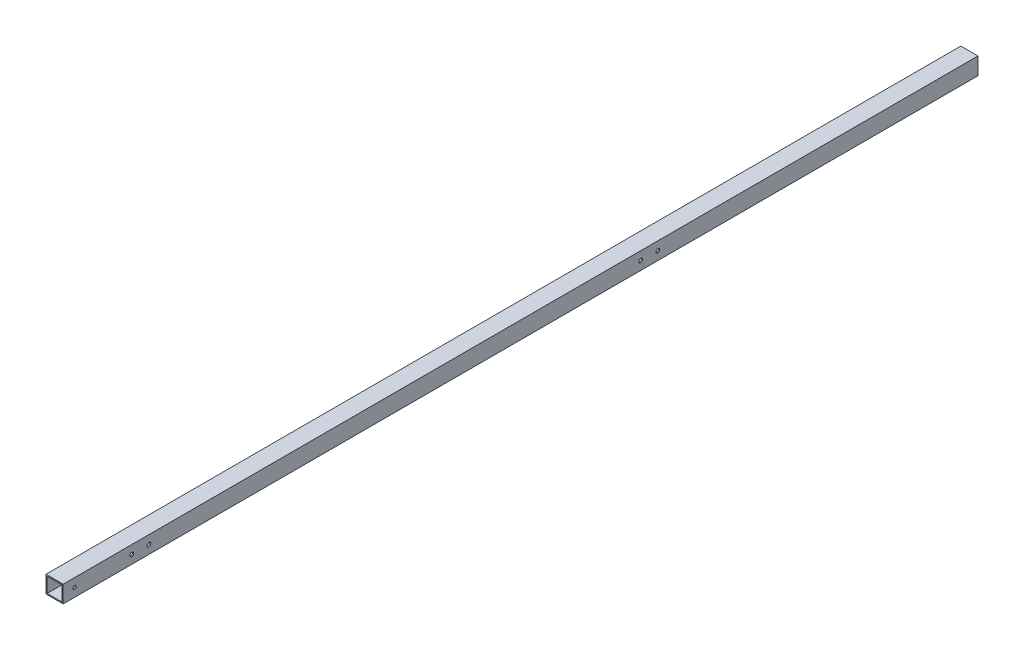
ISO-10303-21;
HEADER;
FILE_DESCRIPTION(('STEP AP214'),'2;1');
FILE_NAME('part.step','',(''),(''),'','','');
FILE_SCHEMA(('AUTOMOTIVE_DESIGN { 1 0 10303 214 1 1 1 1 }'));
ENDSEC;
DATA;
#1=APPLICATION_CONTEXT('core data for automotive mechanical design processes');
#2=APPLICATION_PROTOCOL_DEFINITION('international standard','automotive_design',2000,#1);
#3=PRODUCT_CONTEXT('',#1,'mechanical');
#4=PRODUCT('Part','Part','',(#3));
#5=PRODUCT_RELATED_PRODUCT_CATEGORY('part','',(#4));
#6=PRODUCT_DEFINITION_FORMATION('','',#4);
#7=PRODUCT_DEFINITION_CONTEXT('part definition',#1,'design');
#8=PRODUCT_DEFINITION('design','',#6,#7);
#9=PRODUCT_DEFINITION_SHAPE('','',#8);
#10=(LENGTH_UNIT() NAMED_UNIT(*) SI_UNIT(.MILLI.,.METRE.));
#11=(NAMED_UNIT(*) PLANE_ANGLE_UNIT() SI_UNIT($,.RADIAN.));
#12=(NAMED_UNIT(*) SI_UNIT($,.STERADIAN.) SOLID_ANGLE_UNIT());
#13=UNCERTAINTY_MEASURE_WITH_UNIT(LENGTH_MEASURE(1.E-05),#10,'distance_accuracy_value','');
#14=(GEOMETRIC_REPRESENTATION_CONTEXT(3) GLOBAL_UNCERTAINTY_ASSIGNED_CONTEXT((#13)) GLOBAL_UNIT_ASSIGNED_CONTEXT((#10,
#11,#12)) REPRESENTATION_CONTEXT('',''));
#15=CARTESIAN_POINT('',(0.,0.,0.));
#16=DIRECTION('',(0.,0.,1.));
#17=DIRECTION('',(1.,0.,0.));
#18=AXIS2_PLACEMENT_3D('',#15,#16,#17);
#19=CARTESIAN_POINT('',(0.,0.,800.));
#20=DIRECTION('',(0.,0.,1.));
#21=DIRECTION('',(1.,0.,0.));
#22=AXIS2_PLACEMENT_3D('',#19,#20,#21);
#23=PLANE('',#22);
#24=DIRECTION('',(0.,-1.,0.));
#25=VECTOR('',#24,1.);
#26=CARTESIAN_POINT('',(0.,0.,800.));
#27=LINE('',#26,#25);
#28=CARTESIAN_POINT('',(0.,0.,800.));
#29=VERTEX_POINT('',#28);
#30=CARTESIAN_POINT('',(0.,-15.,800.));
#31=VERTEX_POINT('',#30);
#32=EDGE_CURVE('E170',#29,#31,#27,.T.);
#33=ORIENTED_EDGE('',*,*,#32,.T.);
#34=DIRECTION('',(1.,0.,0.));
#35=VECTOR('',#34,1.);
#36=CARTESIAN_POINT('',(0.,-15.,800.));
#37=LINE('',#36,#35);
#38=CARTESIAN_POINT('',(15.,-15.,800.));
#39=VERTEX_POINT('',#38);
#40=EDGE_CURVE('E173',#31,#39,#37,.T.);
#41=ORIENTED_EDGE('',*,*,#40,.T.);
#42=DIRECTION('',(0.,1.,0.));
#43=VECTOR('',#42,1.);
#44=CARTESIAN_POINT('',(15.,0.,800.));
#45=LINE('',#44,#43);
#46=CARTESIAN_POINT('',(15.,0.,800.));
#47=VERTEX_POINT('',#46);
#48=EDGE_CURVE('E176',#39,#47,#45,.T.);
#49=ORIENTED_EDGE('',*,*,#48,.T.);
#50=DIRECTION('',(-1.,0.,0.));
#51=VECTOR('',#50,1.);
#52=CARTESIAN_POINT('',(0.,0.,800.));
#53=LINE('',#52,#51);
#54=EDGE_CURVE('E178',#47,#29,#53,.T.);
#55=ORIENTED_EDGE('',*,*,#54,.T.);
#56=EDGE_LOOP('',(#33,#41,#49,#55));
#57=FACE_BOUND('',#56,.T.);
#58=DIRECTION('',(1.,0.,0.));
#59=VECTOR('',#58,1.);
#60=CARTESIAN_POINT('',(0.,-14.,800.));
#61=LINE('',#60,#59);
#62=CARTESIAN_POINT('',(1.,-14.,800.));
#63=VERTEX_POINT('',#62);
#64=CARTESIAN_POINT('',(14.,-14.,800.));
#65=VERTEX_POINT('',#64);
#66=EDGE_CURVE('E140',#63,#65,#61,.T.);
#67=ORIENTED_EDGE('',*,*,#66,.F.);
#68=DIRECTION('',(0.,-1.,0.));
#69=VECTOR('',#68,1.);
#70=CARTESIAN_POINT('',(1.,0.,800.));
#71=LINE('',#70,#69);
#72=CARTESIAN_POINT('',(1.,-1.,800.));
#73=VERTEX_POINT('',#72);
#74=EDGE_CURVE('E132',#73,#63,#71,.T.);
#75=ORIENTED_EDGE('',*,*,#74,.F.);
#76=DIRECTION('',(-1.,0.,0.));
#77=VECTOR('',#76,1.);
#78=CARTESIAN_POINT('',(0.,-1.,800.));
#79=LINE('',#78,#77);
#80=CARTESIAN_POINT('',(14.,-1.,800.));
#81=VERTEX_POINT('',#80);
#82=EDGE_CURVE('E154',#81,#73,#79,.T.);
#83=ORIENTED_EDGE('',*,*,#82,.F.);
#84=DIRECTION('',(0.,1.,0.));
#85=VECTOR('',#84,1.);
#86=CARTESIAN_POINT('',(14.,0.,800.));
#87=LINE('',#86,#85);
#88=EDGE_CURVE('E152',#65,#81,#87,.T.);
#89=ORIENTED_EDGE('',*,*,#88,.F.);
#90=EDGE_LOOP('',(#67,#75,#83,#89));
#91=FACE_BOUND('',#90,.T.);
#92=ADVANCED_FACE('F65',(#57,#91),#23,.T.);
#93=CARTESIAN_POINT('',(0.,0.,0.));
#94=DIRECTION('',(0.,0.,1.));
#95=DIRECTION('',(1.,0.,0.));
#96=AXIS2_PLACEMENT_3D('',#93,#94,#95);
#97=PLANE('',#96);
#98=DIRECTION('',(0.,-1.,0.));
#99=VECTOR('',#98,1.);
#100=CARTESIAN_POINT('',(0.,0.,0.));
#101=LINE('',#100,#99);
#102=CARTESIAN_POINT('',(0.,0.,0.));
#103=VERTEX_POINT('',#102);
#104=CARTESIAN_POINT('',(0.,-15.,0.));
#105=VERTEX_POINT('',#104);
#106=EDGE_CURVE('E148',#103,#105,#101,.T.);
#107=ORIENTED_EDGE('',*,*,#106,.F.);
#108=DIRECTION('',(-1.,0.,0.));
#109=VECTOR('',#108,1.);
#110=CARTESIAN_POINT('',(0.,0.,0.));
#111=LINE('',#110,#109);
#112=CARTESIAN_POINT('',(15.,0.,0.));
#113=VERTEX_POINT('',#112);
#114=EDGE_CURVE('E174',#113,#103,#111,.T.);
#115=ORIENTED_EDGE('',*,*,#114,.F.);
#116=DIRECTION('',(0.,1.,0.));
#117=VECTOR('',#116,1.);
#118=CARTESIAN_POINT('',(15.,0.,0.));
#119=LINE('',#118,#117);
#120=CARTESIAN_POINT('',(15.,-15.,0.));
#121=VERTEX_POINT('',#120);
#122=EDGE_CURVE('E185',#121,#113,#119,.T.);
#123=ORIENTED_EDGE('',*,*,#122,.F.);
#124=DIRECTION('',(1.,0.,0.));
#125=VECTOR('',#124,1.);
#126=CARTESIAN_POINT('',(0.,-15.,0.));
#127=LINE('',#126,#125);
#128=EDGE_CURVE('E183',#105,#121,#127,.T.);
#129=ORIENTED_EDGE('',*,*,#128,.F.);
#130=EDGE_LOOP('',(#107,#115,#123,#129));
#131=FACE_BOUND('',#130,.T.);
#132=DIRECTION('',(0.,-1.,0.));
#133=VECTOR('',#132,1.);
#134=CARTESIAN_POINT('',(1.,0.,0.));
#135=LINE('',#134,#133);
#136=CARTESIAN_POINT('',(1.,-1.,0.));
#137=VERTEX_POINT('',#136);
#138=CARTESIAN_POINT('',(1.,-14.,0.));
#139=VERTEX_POINT('',#138);
#140=EDGE_CURVE('E90',#137,#139,#135,.T.);
#141=ORIENTED_EDGE('',*,*,#140,.T.);
#142=DIRECTION('',(1.,0.,0.));
#143=VECTOR('',#142,1.);
#144=CARTESIAN_POINT('',(0.,-14.,0.));
#145=LINE('',#144,#143);
#146=CARTESIAN_POINT('',(14.,-14.,0.));
#147=VERTEX_POINT('',#146);
#148=EDGE_CURVE('E147',#139,#147,#145,.T.);
#149=ORIENTED_EDGE('',*,*,#148,.T.);
#150=DIRECTION('',(0.,1.,0.));
#151=VECTOR('',#150,1.);
#152=CARTESIAN_POINT('',(14.,0.,0.));
#153=LINE('',#152,#151);
#154=CARTESIAN_POINT('',(14.,-1.,0.));
#155=VERTEX_POINT('',#154);
#156=EDGE_CURVE('E162',#147,#155,#153,.T.);
#157=ORIENTED_EDGE('',*,*,#156,.T.);
#158=DIRECTION('',(-1.,0.,0.));
#159=VECTOR('',#158,1.);
#160=CARTESIAN_POINT('',(0.,-1.,0.));
#161=LINE('',#160,#159);
#162=EDGE_CURVE('E141',#155,#137,#161,.T.);
#163=ORIENTED_EDGE('',*,*,#162,.T.);
#164=EDGE_LOOP('',(#141,#149,#157,#163));
#165=FACE_BOUND('',#164,.T.);
#166=ADVANCED_FACE('F253',(#131,#165),#97,.F.);
#167=CARTESIAN_POINT('',(0.,0.,800.));
#168=DIRECTION('',(1.,0.,0.));
#169=DIRECTION('',(0.,1.,0.));
#170=AXIS2_PLACEMENT_3D('',#167,#168,#169);
#171=PLANE('',#170);
#172=CARTESIAN_POINT('',(0.,-7.5,280.));
#173=DIRECTION('',(1.,0.,0.));
#174=DIRECTION('',(0.,1.,0.));
#175=AXIS2_PLACEMENT_3D('',#172,#173,#174);
#176=CIRCLE('',#175,1.64999999999999);
#177=CARTESIAN_POINT('',(0.,-5.85000000000001,280.));
#178=VERTEX_POINT('',#177);
#179=EDGE_CURVE('E203',#178,#178,#176,.T.);
#180=ORIENTED_EDGE('',*,*,#179,.T.);
#181=EDGE_LOOP('',(#180));
#182=FACE_BOUND('',#181,.T.);
#183=CARTESIAN_POINT('',(0.,-7.5,295.));
#184=DIRECTION('',(1.,0.,0.));
#185=DIRECTION('',(0.,1.,0.));
#186=AXIS2_PLACEMENT_3D('',#183,#184,#185);
#187=CIRCLE('',#186,1.64999999999999);
#188=CARTESIAN_POINT('',(0.,-5.85000000000001,295.));
#189=VERTEX_POINT('',#188);
#190=EDGE_CURVE('E336',#189,#189,#187,.T.);
#191=ORIENTED_EDGE('',*,*,#190,.T.);
#192=EDGE_LOOP('',(#191));
#193=FACE_BOUND('',#192,.T.);
#194=CARTESIAN_POINT('',(0.,-7.5,725.));
#195=DIRECTION('',(1.,0.,0.));
#196=DIRECTION('',(0.,1.,0.));
#197=AXIS2_PLACEMENT_3D('',#194,#195,#196);
#198=CIRCLE('',#197,1.65000000000005);
#199=CARTESIAN_POINT('',(0.,-5.84999999999996,725.));
#200=VERTEX_POINT('',#199);
#201=EDGE_CURVE('E342',#200,#200,#198,.T.);
#202=ORIENTED_EDGE('',*,*,#201,.T.);
#203=EDGE_LOOP('',(#202));
#204=FACE_BOUND('',#203,.T.);
#205=CARTESIAN_POINT('',(0.,-7.5,740.));
#206=DIRECTION('',(1.,0.,0.));
#207=DIRECTION('',(0.,1.,0.));
#208=AXIS2_PLACEMENT_3D('',#205,#206,#207);
#209=CIRCLE('',#208,1.65000000000005);
#210=CARTESIAN_POINT('',(0.,-5.84999999999996,740.));
#211=VERTEX_POINT('',#210);
#212=EDGE_CURVE('E347',#211,#211,#209,.T.);
#213=ORIENTED_EDGE('',*,*,#212,.T.);
#214=EDGE_LOOP('',(#213));
#215=FACE_BOUND('',#214,.T.);
#216=CARTESIAN_POINT('',(0.,-7.5,790.));
#217=DIRECTION('',(1.,0.,0.));
#218=DIRECTION('',(0.,1.,0.));
#219=AXIS2_PLACEMENT_3D('',#216,#217,#218);
#220=CIRCLE('',#219,1.49999999999997);
#221=CARTESIAN_POINT('',(0.,-6.00000000000004,790.));
#222=VERTEX_POINT('',#221);
#223=EDGE_CURVE('E198',#222,#222,#220,.T.);
#224=ORIENTED_EDGE('',*,*,#223,.T.);
#225=EDGE_LOOP('',(#224));
#226=FACE_BOUND('',#225,.T.);
#227=ORIENTED_EDGE('',*,*,#106,.T.);
#228=DIRECTION('',(0.,0.,-1.));
#229=VECTOR('',#228,1.);
#230=CARTESIAN_POINT('',(0.,-15.,800.));
#231=LINE('',#230,#229);
#232=EDGE_CURVE('E12',#31,#105,#231,.T.);
#233=ORIENTED_EDGE('',*,*,#232,.F.);
#234=ORIENTED_EDGE('',*,*,#32,.F.);
#235=DIRECTION('',(0.,0.,-1.));
#236=VECTOR('',#235,1.);
#237=CARTESIAN_POINT('',(0.,0.,800.));
#238=LINE('',#237,#236);
#239=EDGE_CURVE('E180',#29,#103,#238,.T.);
#240=ORIENTED_EDGE('',*,*,#239,.T.);
#241=EDGE_LOOP('',(#227,#233,#234,#240));
#242=FACE_BOUND('',#241,.T.);
#243=ADVANCED_FACE('F67',(#182,#193,#204,#215,#226,#242),#171,.F.);
#244=CARTESIAN_POINT('',(0.,-15.,800.));
#245=DIRECTION('',(0.,1.,0.));
#246=DIRECTION('',(0.,0.,1.));
#247=AXIS2_PLACEMENT_3D('',#244,#245,#246);
#248=PLANE('',#247);
#249=ORIENTED_EDGE('',*,*,#128,.T.);
#250=DIRECTION('',(0.,0.,-1.));
#251=VECTOR('',#250,1.);
#252=CARTESIAN_POINT('',(15.,-15.,800.));
#253=LINE('',#252,#251);
#254=EDGE_CURVE('E74',#39,#121,#253,.T.);
#255=ORIENTED_EDGE('',*,*,#254,.F.);
#256=ORIENTED_EDGE('',*,*,#40,.F.);
#257=ORIENTED_EDGE('',*,*,#232,.T.);
#258=EDGE_LOOP('',(#249,#255,#256,#257));
#259=FACE_BOUND('',#258,.T.);
#260=ADVANCED_FACE('F261',(#259),#248,.F.);
#261=CARTESIAN_POINT('',(15.,0.,800.));
#262=DIRECTION('',(-1.,0.,0.));
#263=DIRECTION('',(0.,-1.,0.));
#264=AXIS2_PLACEMENT_3D('',#261,#262,#263);
#265=PLANE('',#264);
#266=CARTESIAN_POINT('',(15.,-7.5,280.));
#267=DIRECTION('',(1.,0.,0.));
#268=DIRECTION('',(0.,1.,0.));
#269=AXIS2_PLACEMENT_3D('',#266,#267,#268);
#270=CIRCLE('',#269,1.64999999999999);
#271=CARTESIAN_POINT('',(15.,-5.85000000000001,280.));
#272=VERTEX_POINT('',#271);
#273=EDGE_CURVE('E328',#272,#272,#270,.T.);
#274=ORIENTED_EDGE('',*,*,#273,.F.);
#275=EDGE_LOOP('',(#274));
#276=FACE_BOUND('',#275,.T.);
#277=CARTESIAN_POINT('',(15.,-7.5,295.));
#278=DIRECTION('',(1.,0.,0.));
#279=DIRECTION('',(0.,1.,0.));
#280=AXIS2_PLACEMENT_3D('',#277,#278,#279);
#281=CIRCLE('',#280,1.64999999999999);
#282=CARTESIAN_POINT('',(15.,-5.85000000000001,295.));
#283=VERTEX_POINT('',#282);
#284=EDGE_CURVE('E331',#283,#283,#281,.T.);
#285=ORIENTED_EDGE('',*,*,#284,.F.);
#286=EDGE_LOOP('',(#285));
#287=FACE_BOUND('',#286,.T.);
#288=CARTESIAN_POINT('',(15.,-7.5,725.));
#289=DIRECTION('',(1.,0.,0.));
#290=DIRECTION('',(0.,1.,0.));
#291=AXIS2_PLACEMENT_3D('',#288,#289,#290);
#292=CIRCLE('',#291,1.65000000000005);
#293=CARTESIAN_POINT('',(15.,-5.84999999999995,725.));
#294=VERTEX_POINT('',#293);
#295=EDGE_CURVE('E339',#294,#294,#292,.T.);
#296=ORIENTED_EDGE('',*,*,#295,.F.);
#297=EDGE_LOOP('',(#296));
#298=FACE_BOUND('',#297,.T.);
#299=CARTESIAN_POINT('',(15.,-7.5,740.));
#300=DIRECTION('',(1.,0.,0.));
#301=DIRECTION('',(0.,1.,0.));
#302=AXIS2_PLACEMENT_3D('',#299,#300,#301);
#303=CIRCLE('',#302,1.65000000000005);
#304=CARTESIAN_POINT('',(15.,-5.84999999999995,740.));
#305=VERTEX_POINT('',#304);
#306=EDGE_CURVE('E345',#305,#305,#303,.T.);
#307=ORIENTED_EDGE('',*,*,#306,.F.);
#308=EDGE_LOOP('',(#307));
#309=FACE_BOUND('',#308,.T.);
#310=CARTESIAN_POINT('',(15.,-7.5,790.));
#311=DIRECTION('',(1.,0.,0.));
#312=DIRECTION('',(0.,1.,0.));
#313=AXIS2_PLACEMENT_3D('',#310,#311,#312);
#314=CIRCLE('',#313,1.49999999999997);
#315=CARTESIAN_POINT('',(15.,-6.00000000000003,790.));
#316=VERTEX_POINT('',#315);
#317=EDGE_CURVE('E224',#316,#316,#314,.T.);
#318=ORIENTED_EDGE('',*,*,#317,.F.);
#319=EDGE_LOOP('',(#318));
#320=FACE_BOUND('',#319,.T.);
#321=ORIENTED_EDGE('',*,*,#122,.T.);
#322=DIRECTION('',(0.,0.,-1.));
#323=VECTOR('',#322,1.);
#324=CARTESIAN_POINT('',(15.,0.,800.));
#325=LINE('',#324,#323);
#326=EDGE_CURVE('E190',#47,#113,#325,.T.);
#327=ORIENTED_EDGE('',*,*,#326,.F.);
#328=ORIENTED_EDGE('',*,*,#48,.F.);
#329=ORIENTED_EDGE('',*,*,#254,.T.);
#330=EDGE_LOOP('',(#321,#327,#328,#329));
#331=FACE_BOUND('',#330,.T.);
#332=ADVANCED_FACE('F246',(#276,#287,#298,#309,#320,#331),#265,.F.);
#333=CARTESIAN_POINT('',(0.,0.,800.));
#334=DIRECTION('',(0.,-1.,0.));
#335=DIRECTION('',(0.,0.,-1.));
#336=AXIS2_PLACEMENT_3D('',#333,#334,#335);
#337=PLANE('',#336);
#338=ORIENTED_EDGE('',*,*,#114,.T.);
#339=ORIENTED_EDGE('',*,*,#239,.F.);
#340=ORIENTED_EDGE('',*,*,#54,.F.);
#341=ORIENTED_EDGE('',*,*,#326,.T.);
#342=EDGE_LOOP('',(#338,#339,#340,#341));
#343=FACE_BOUND('',#342,.T.);
#344=ADVANCED_FACE('F235',(#343),#337,.F.);
#345=CARTESIAN_POINT('',(1.,0.,800.));
#346=DIRECTION('',(1.,0.,0.));
#347=DIRECTION('',(0.,1.,0.));
#348=AXIS2_PLACEMENT_3D('',#345,#346,#347);
#349=PLANE('',#348);
#350=CARTESIAN_POINT('',(1.,-7.5,280.));
#351=DIRECTION('',(1.,0.,0.));
#352=DIRECTION('',(0.,1.,0.));
#353=AXIS2_PLACEMENT_3D('',#350,#351,#352);
#354=CIRCLE('',#353,1.64999999999999);
#355=CARTESIAN_POINT('',(1.,-5.85000000000001,280.));
#356=VERTEX_POINT('',#355);
#357=EDGE_CURVE('E221',#356,#356,#354,.T.);
#358=ORIENTED_EDGE('',*,*,#357,.F.);
#359=EDGE_LOOP('',(#358));
#360=FACE_BOUND('',#359,.T.);
#361=CARTESIAN_POINT('',(1.,-7.5,295.));
#362=DIRECTION('',(1.,0.,0.));
#363=DIRECTION('',(0.,1.,0.));
#364=AXIS2_PLACEMENT_3D('',#361,#362,#363);
#365=CIRCLE('',#364,1.64999999999999);
#366=CARTESIAN_POINT('',(1.,-5.85000000000001,295.));
#367=VERTEX_POINT('',#366);
#368=EDGE_CURVE('E209',#367,#367,#365,.T.);
#369=ORIENTED_EDGE('',*,*,#368,.F.);
#370=EDGE_LOOP('',(#369));
#371=FACE_BOUND('',#370,.T.);
#372=CARTESIAN_POINT('',(1.,-7.5,725.));
#373=DIRECTION('',(1.,0.,0.));
#374=DIRECTION('',(0.,1.,0.));
#375=AXIS2_PLACEMENT_3D('',#372,#373,#374);
#376=CIRCLE('',#375,1.65000000000005);
#377=CARTESIAN_POINT('',(1.,-5.84999999999996,725.));
#378=VERTEX_POINT('',#377);
#379=EDGE_CURVE('E206',#378,#378,#376,.T.);
#380=ORIENTED_EDGE('',*,*,#379,.F.);
#381=EDGE_LOOP('',(#380));
#382=FACE_BOUND('',#381,.T.);
#383=CARTESIAN_POINT('',(1.,-7.5,740.));
#384=DIRECTION('',(1.,0.,0.));
#385=DIRECTION('',(0.,1.,0.));
#386=AXIS2_PLACEMENT_3D('',#383,#384,#385);
#387=CIRCLE('',#386,1.65000000000005);
#388=CARTESIAN_POINT('',(1.,-5.84999999999996,740.));
#389=VERTEX_POINT('',#388);
#390=EDGE_CURVE('E202',#389,#389,#387,.T.);
#391=ORIENTED_EDGE('',*,*,#390,.F.);
#392=EDGE_LOOP('',(#391));
#393=FACE_BOUND('',#392,.T.);
#394=CARTESIAN_POINT('',(1.,-7.5,790.));
#395=DIRECTION('',(1.,0.,0.));
#396=DIRECTION('',(0.,1.,0.));
#397=AXIS2_PLACEMENT_3D('',#394,#395,#396);
#398=CIRCLE('',#397,1.49999999999997);
#399=CARTESIAN_POINT('',(1.,-6.00000000000004,790.));
#400=VERTEX_POINT('',#399);
#401=EDGE_CURVE('E160',#400,#400,#398,.T.);
#402=ORIENTED_EDGE('',*,*,#401,.F.);
#403=EDGE_LOOP('',(#402));
#404=FACE_BOUND('',#403,.T.);
#405=ORIENTED_EDGE('',*,*,#140,.F.);
#406=DIRECTION('',(0.,0.,-1.));
#407=VECTOR('',#406,1.);
#408=CARTESIAN_POINT('',(1.,-1.,800.));
#409=LINE('',#408,#407);
#410=EDGE_CURVE('E136',#73,#137,#409,.T.);
#411=ORIENTED_EDGE('',*,*,#410,.F.);
#412=ORIENTED_EDGE('',*,*,#74,.T.);
#413=DIRECTION('',(0.,0.,-1.));
#414=VECTOR('',#413,1.);
#415=CARTESIAN_POINT('',(1.,-14.,800.));
#416=LINE('',#415,#414);
#417=EDGE_CURVE('E135',#63,#139,#416,.T.);
#418=ORIENTED_EDGE('',*,*,#417,.T.);
#419=EDGE_LOOP('',(#405,#411,#412,#418));
#420=FACE_BOUND('',#419,.T.);
#421=ADVANCED_FACE('F134',(#360,#371,#382,#393,#404,#420),#349,.T.);
#422=CARTESIAN_POINT('',(0.,-14.,800.));
#423=DIRECTION('',(0.,1.,0.));
#424=DIRECTION('',(0.,0.,1.));
#425=AXIS2_PLACEMENT_3D('',#422,#423,#424);
#426=PLANE('',#425);
#427=ORIENTED_EDGE('',*,*,#148,.F.);
#428=ORIENTED_EDGE('',*,*,#417,.F.);
#429=ORIENTED_EDGE('',*,*,#66,.T.);
#430=DIRECTION('',(0.,0.,-1.));
#431=VECTOR('',#430,1.);
#432=CARTESIAN_POINT('',(14.,-14.,800.));
#433=LINE('',#432,#431);
#434=EDGE_CURVE('E149',#65,#147,#433,.T.);
#435=ORIENTED_EDGE('',*,*,#434,.T.);
#436=EDGE_LOOP('',(#427,#428,#429,#435));
#437=FACE_BOUND('',#436,.T.);
#438=ADVANCED_FACE('F144',(#437),#426,.T.);
#439=CARTESIAN_POINT('',(14.,0.,800.));
#440=DIRECTION('',(-1.,0.,0.));
#441=DIRECTION('',(0.,-1.,0.));
#442=AXIS2_PLACEMENT_3D('',#439,#440,#441);
#443=PLANE('',#442);
#444=CARTESIAN_POINT('',(14.,-7.5,280.));
#445=DIRECTION('',(-1.,0.,0.));
#446=DIRECTION('',(0.,-1.,0.));
#447=AXIS2_PLACEMENT_3D('',#444,#445,#446);
#448=CIRCLE('',#447,1.64999999999999);
#449=CARTESIAN_POINT('',(14.,-9.14999999999999,280.));
#450=VERTEX_POINT('',#449);
#451=EDGE_CURVE('E69',#450,#450,#448,.T.);
#452=ORIENTED_EDGE('',*,*,#451,.F.);
#453=EDGE_LOOP('',(#452));
#454=FACE_BOUND('',#453,.T.);
#455=CARTESIAN_POINT('',(14.,-7.5,295.));
#456=DIRECTION('',(-1.,0.,0.));
#457=DIRECTION('',(0.,-1.,0.));
#458=AXIS2_PLACEMENT_3D('',#455,#456,#457);
#459=CIRCLE('',#458,1.64999999999999);
#460=CARTESIAN_POINT('',(14.,-9.14999999999999,295.));
#461=VERTEX_POINT('',#460);
#462=EDGE_CURVE('E207',#461,#461,#459,.T.);
#463=ORIENTED_EDGE('',*,*,#462,.F.);
#464=EDGE_LOOP('',(#463));
#465=FACE_BOUND('',#464,.T.);
#466=CARTESIAN_POINT('',(14.,-7.5,725.));
#467=DIRECTION('',(-1.,0.,0.));
#468=DIRECTION('',(0.,-1.,0.));
#469=AXIS2_PLACEMENT_3D('',#466,#467,#468);
#470=CIRCLE('',#469,1.65000000000005);
#471=CARTESIAN_POINT('',(14.,-9.15000000000004,725.));
#472=VERTEX_POINT('',#471);
#473=EDGE_CURVE('E204',#472,#472,#470,.T.);
#474=ORIENTED_EDGE('',*,*,#473,.F.);
#475=EDGE_LOOP('',(#474));
#476=FACE_BOUND('',#475,.T.);
#477=CARTESIAN_POINT('',(14.,-7.5,740.));
#478=DIRECTION('',(-1.,0.,0.));
#479=DIRECTION('',(0.,-1.,0.));
#480=AXIS2_PLACEMENT_3D('',#477,#478,#479);
#481=CIRCLE('',#480,1.65000000000005);
#482=CARTESIAN_POINT('',(14.,-9.15000000000004,740.));
#483=VERTEX_POINT('',#482);
#484=EDGE_CURVE('E199',#483,#483,#481,.T.);
#485=ORIENTED_EDGE('',*,*,#484,.F.);
#486=EDGE_LOOP('',(#485));
#487=FACE_BOUND('',#486,.T.);
#488=CARTESIAN_POINT('',(14.,-7.5,790.));
#489=DIRECTION('',(-1.,0.,0.));
#490=DIRECTION('',(0.,-1.,0.));
#491=AXIS2_PLACEMENT_3D('',#488,#489,#490);
#492=CIRCLE('',#491,1.49999999999997);
#493=CARTESIAN_POINT('',(14.,-8.99999999999997,790.));
#494=VERTEX_POINT('',#493);
#495=EDGE_CURVE('E195',#494,#494,#492,.T.);
#496=ORIENTED_EDGE('',*,*,#495,.F.);
#497=EDGE_LOOP('',(#496));
#498=FACE_BOUND('',#497,.T.);
#499=ORIENTED_EDGE('',*,*,#156,.F.);
#500=ORIENTED_EDGE('',*,*,#434,.F.);
#501=ORIENTED_EDGE('',*,*,#88,.T.);
#502=DIRECTION('',(0.,0.,-1.));
#503=VECTOR('',#502,1.);
#504=CARTESIAN_POINT('',(14.,-1.,800.));
#505=LINE('',#504,#503);
#506=EDGE_CURVE('E82',#81,#155,#505,.T.);
#507=ORIENTED_EDGE('',*,*,#506,.T.);
#508=EDGE_LOOP('',(#499,#500,#501,#507));
#509=FACE_BOUND('',#508,.T.);
#510=ADVANCED_FACE('F243',(#454,#465,#476,#487,#498,#509),#443,.T.);
#511=CARTESIAN_POINT('',(0.,-1.,800.));
#512=DIRECTION('',(0.,-1.,0.));
#513=DIRECTION('',(0.,0.,-1.));
#514=AXIS2_PLACEMENT_3D('',#511,#512,#513);
#515=PLANE('',#514);
#516=ORIENTED_EDGE('',*,*,#162,.F.);
#517=ORIENTED_EDGE('',*,*,#506,.F.);
#518=ORIENTED_EDGE('',*,*,#82,.T.);
#519=ORIENTED_EDGE('',*,*,#410,.T.);
#520=EDGE_LOOP('',(#516,#517,#518,#519));
#521=FACE_BOUND('',#520,.T.);
#522=ADVANCED_FACE('F283',(#521),#515,.T.);
#523=CARTESIAN_POINT('',(0.,-7.5,790.));
#524=DIRECTION('',(1.,0.,0.));
#525=DIRECTION('',(0.,1.,0.));
#526=AXIS2_PLACEMENT_3D('',#523,#524,#525);
#527=CYLINDRICAL_SURFACE('',#526,1.49999999999997);
#528=ORIENTED_EDGE('',*,*,#495,.T.);
#529=EDGE_LOOP('',(#528));
#530=FACE_BOUND('',#529,.T.);
#531=ORIENTED_EDGE('',*,*,#317,.T.);
#532=EDGE_LOOP('',(#531));
#533=FACE_BOUND('',#532,.T.);
#534=ADVANCED_FACE('F285',(#530,#533),#527,.F.);
#535=ORIENTED_EDGE('',*,*,#401,.T.);
#536=EDGE_LOOP('',(#535));
#537=FACE_BOUND('',#536,.T.);
#538=ORIENTED_EDGE('',*,*,#223,.F.);
#539=EDGE_LOOP('',(#538));
#540=FACE_BOUND('',#539,.T.);
#541=ADVANCED_FACE('F231',(#537,#540),#527,.F.);
#542=CARTESIAN_POINT('',(0.,-7.5,740.));
#543=DIRECTION('',(1.,0.,0.));
#544=DIRECTION('',(0.,1.,0.));
#545=AXIS2_PLACEMENT_3D('',#542,#543,#544);
#546=CYLINDRICAL_SURFACE('',#545,1.65000000000005);
#547=ORIENTED_EDGE('',*,*,#484,.T.);
#548=EDGE_LOOP('',(#547));
#549=FACE_BOUND('',#548,.T.);
#550=ORIENTED_EDGE('',*,*,#306,.T.);
#551=EDGE_LOOP('',(#550));
#552=FACE_BOUND('',#551,.T.);
#553=ADVANCED_FACE('F295',(#549,#552),#546,.F.);
#554=CARTESIAN_POINT('',(0.,-7.5,725.));
#555=DIRECTION('',(1.,0.,0.));
#556=DIRECTION('',(0.,1.,0.));
#557=AXIS2_PLACEMENT_3D('',#554,#555,#556);
#558=CYLINDRICAL_SURFACE('',#557,1.65000000000005);
#559=ORIENTED_EDGE('',*,*,#473,.T.);
#560=EDGE_LOOP('',(#559));
#561=FACE_BOUND('',#560,.T.);
#562=ORIENTED_EDGE('',*,*,#295,.T.);
#563=EDGE_LOOP('',(#562));
#564=FACE_BOUND('',#563,.T.);
#565=ADVANCED_FACE('F298',(#561,#564),#558,.F.);
#566=CARTESIAN_POINT('',(0.,-7.5,295.));
#567=DIRECTION('',(1.,0.,0.));
#568=DIRECTION('',(0.,1.,0.));
#569=AXIS2_PLACEMENT_3D('',#566,#567,#568);
#570=CYLINDRICAL_SURFACE('',#569,1.64999999999999);
#571=ORIENTED_EDGE('',*,*,#462,.T.);
#572=EDGE_LOOP('',(#571));
#573=FACE_BOUND('',#572,.T.);
#574=ORIENTED_EDGE('',*,*,#284,.T.);
#575=EDGE_LOOP('',(#574));
#576=FACE_BOUND('',#575,.T.);
#577=ADVANCED_FACE('F303',(#573,#576),#570,.F.);
#578=CARTESIAN_POINT('',(0.,-7.5,280.));
#579=DIRECTION('',(1.,0.,0.));
#580=DIRECTION('',(0.,1.,0.));
#581=AXIS2_PLACEMENT_3D('',#578,#579,#580);
#582=CYLINDRICAL_SURFACE('',#581,1.64999999999999);
#583=ORIENTED_EDGE('',*,*,#451,.T.);
#584=EDGE_LOOP('',(#583));
#585=FACE_BOUND('',#584,.T.);
#586=ORIENTED_EDGE('',*,*,#273,.T.);
#587=EDGE_LOOP('',(#586));
#588=FACE_BOUND('',#587,.T.);
#589=ADVANCED_FACE('F308',(#585,#588),#582,.F.);
#590=ORIENTED_EDGE('',*,*,#390,.T.);
#591=EDGE_LOOP('',(#590));
#592=FACE_BOUND('',#591,.T.);
#593=ORIENTED_EDGE('',*,*,#212,.F.);
#594=EDGE_LOOP('',(#593));
#595=FACE_BOUND('',#594,.T.);
#596=ADVANCED_FACE('F300',(#592,#595),#546,.F.);
#597=ORIENTED_EDGE('',*,*,#379,.T.);
#598=EDGE_LOOP('',(#597));
#599=FACE_BOUND('',#598,.T.);
#600=ORIENTED_EDGE('',*,*,#201,.F.);
#601=EDGE_LOOP('',(#600));
#602=FACE_BOUND('',#601,.T.);
#603=ADVANCED_FACE('F305',(#599,#602),#558,.F.);
#604=ORIENTED_EDGE('',*,*,#368,.T.);
#605=EDGE_LOOP('',(#604));
#606=FACE_BOUND('',#605,.T.);
#607=ORIENTED_EDGE('',*,*,#190,.F.);
#608=EDGE_LOOP('',(#607));
#609=FACE_BOUND('',#608,.T.);
#610=ADVANCED_FACE('F309',(#606,#609),#570,.F.);
#611=ORIENTED_EDGE('',*,*,#357,.T.);
#612=EDGE_LOOP('',(#611));
#613=FACE_BOUND('',#612,.T.);
#614=ORIENTED_EDGE('',*,*,#179,.F.);
#615=EDGE_LOOP('',(#614));
#616=FACE_BOUND('',#615,.T.);
#617=ADVANCED_FACE('F312',(#613,#616),#582,.F.);
#618=CLOSED_SHELL('',(#92,#166,#243,#260,#332,#344,#421,#438,#510,#522,#534,#541,#553,#565,#577,
#589,#596,#603,#610,#617));
#619=MANIFOLD_SOLID_BREP('B2',#618);
#620=ADVANCED_BREP_SHAPE_REPRESENTATION('',(#18,#619),#14);
#621=SHAPE_DEFINITION_REPRESENTATION(#9,#620);
ENDSEC;
END-ISO-10303-21;
